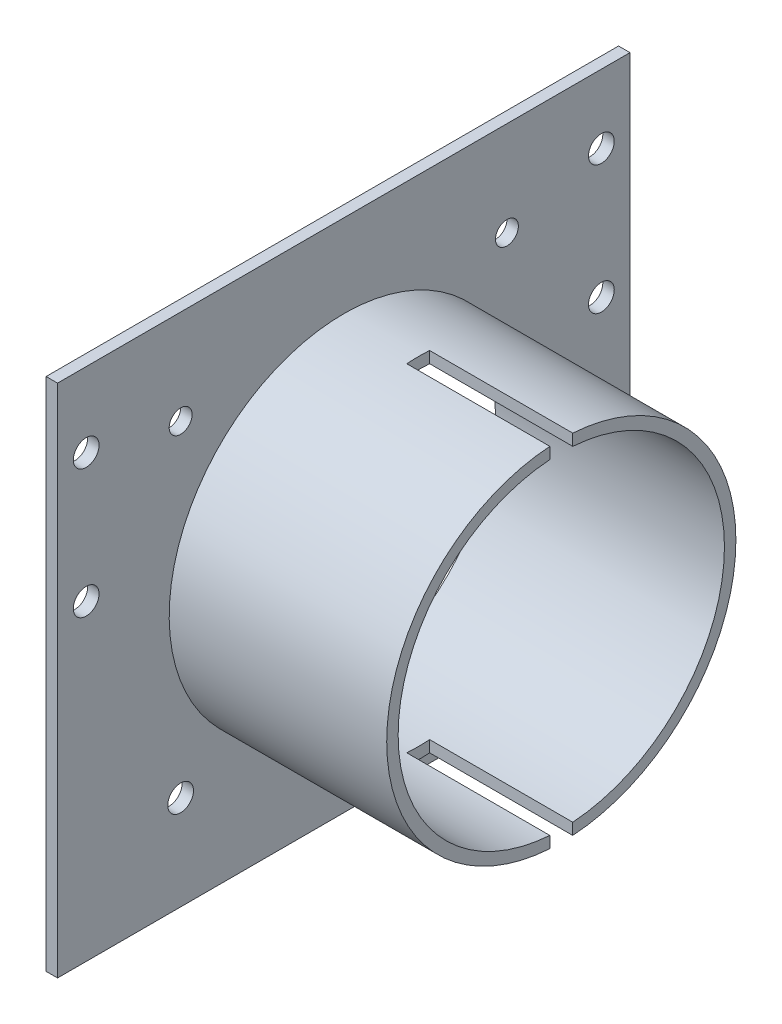
ISO-10303-21;
HEADER;
FILE_DESCRIPTION(('STEP AP214'),'2;1');
FILE_NAME('part.step','',(''),(''),'','','');
FILE_SCHEMA(('AUTOMOTIVE_DESIGN { 1 0 10303 214 1 1 1 1 }'));
ENDSEC;
DATA;
#1=APPLICATION_CONTEXT('core data for automotive mechanical design processes');
#2=APPLICATION_PROTOCOL_DEFINITION('international standard','automotive_design',2000,#1);
#3=PRODUCT_CONTEXT('',#1,'mechanical');
#4=PRODUCT('Part','Part','',(#3));
#5=PRODUCT_RELATED_PRODUCT_CATEGORY('part','',(#4));
#6=PRODUCT_DEFINITION_FORMATION('','',#4);
#7=PRODUCT_DEFINITION_CONTEXT('part definition',#1,'design');
#8=PRODUCT_DEFINITION('design','',#6,#7);
#9=PRODUCT_DEFINITION_SHAPE('','',#8);
#10=(LENGTH_UNIT() NAMED_UNIT(*) SI_UNIT(.MILLI.,.METRE.));
#11=(NAMED_UNIT(*) PLANE_ANGLE_UNIT() SI_UNIT($,.RADIAN.));
#12=(NAMED_UNIT(*) SI_UNIT($,.STERADIAN.) SOLID_ANGLE_UNIT());
#13=UNCERTAINTY_MEASURE_WITH_UNIT(LENGTH_MEASURE(1.E-05),#10,'distance_accuracy_value','');
#14=(GEOMETRIC_REPRESENTATION_CONTEXT(3) GLOBAL_UNCERTAINTY_ASSIGNED_CONTEXT((#13)) GLOBAL_UNIT_ASSIGNED_CONTEXT((#10,
#11,#12)) REPRESENTATION_CONTEXT('',''));
#15=CARTESIAN_POINT('',(0.,0.,0.));
#16=DIRECTION('',(0.,0.,1.));
#17=DIRECTION('',(1.,0.,0.));
#18=AXIS2_PLACEMENT_3D('',#15,#16,#17);
#19=CARTESIAN_POINT('',(80.,0.,0.));
#20=DIRECTION('',(1.,0.,0.));
#21=DIRECTION('',(0.,0.,-1.));
#22=AXIS2_PLACEMENT_3D('',#19,#20,#21);
#23=PLANE('',#22);
#24=DIRECTION('',(0.,-1.,0.));
#25=VECTOR('',#24,1.);
#26=CARTESIAN_POINT('',(80.,45.4181911125714,4.));
#27=LINE('',#26,#25);
#28=CARTESIAN_POINT('',(80.,60.8687111741328,4.));
#29=VERTEX_POINT('',#28);
#30=CARTESIAN_POINT('',(80.,56.859475903318,4.));
#31=VERTEX_POINT('',#30);
#32=EDGE_CURVE('E255',#29,#31,#27,.T.);
#33=ORIENTED_EDGE('',*,*,#32,.F.);
#34=CARTESIAN_POINT('',(80.,0.,0.));
#35=DIRECTION('',(1.,0.,0.));
#36=DIRECTION('',(0.,0.,-1.));
#37=AXIS2_PLACEMENT_3D('',#34,#35,#36);
#38=CIRCLE('',#37,61.);
#39=CARTESIAN_POINT('',(80.,-60.8687111741328,4.));
#40=VERTEX_POINT('',#39);
#41=EDGE_CURVE('E153',#29,#40,#38,.T.);
#42=ORIENTED_EDGE('',*,*,#41,.T.);
#43=DIRECTION('',(0.,-1.,0.));
#44=VECTOR('',#43,1.);
#45=CARTESIAN_POINT('',(80.,-45.4181911125714,4.));
#46=LINE('',#45,#44);
#47=CARTESIAN_POINT('',(80.,-56.859475903318,4.));
#48=VERTEX_POINT('',#47);
#49=EDGE_CURVE('E145',#48,#40,#46,.T.);
#50=ORIENTED_EDGE('',*,*,#49,.F.);
#51=CARTESIAN_POINT('',(80.,0.,0.));
#52=DIRECTION('',(1.,0.,0.));
#53=DIRECTION('',(0.,0.,-1.));
#54=AXIS2_PLACEMENT_3D('',#51,#52,#53);
#55=CIRCLE('',#54,57.);
#56=EDGE_CURVE('E159',#31,#48,#55,.T.);
#57=ORIENTED_EDGE('',*,*,#56,.F.);
#58=EDGE_LOOP('',(#33,#42,#50,#57));
#59=FACE_BOUND('',#58,.T.);
#60=ADVANCED_FACE('F33',(#59),#23,.T.);
#61=CARTESIAN_POINT('',(4.,0.,0.));
#62=DIRECTION('',(1.,0.,0.));
#63=DIRECTION('',(0.,0.,-1.));
#64=AXIS2_PLACEMENT_3D('',#61,#62,#63);
#65=PLANE('',#64);
#66=CARTESIAN_POINT('',(4.,64.,89.9999999999999));
#67=DIRECTION('',(1.,0.,0.));
#68=DIRECTION('',(0.,0.,-1.));
#69=AXIS2_PLACEMENT_3D('',#66,#67,#68);
#70=CIRCLE('',#69,4.49999999999999);
#71=CARTESIAN_POINT('',(4.,64.,85.4999999999999));
#72=VERTEX_POINT('',#71);
#73=EDGE_CURVE('E230',#72,#72,#70,.T.);
#74=ORIENTED_EDGE('',*,*,#73,.F.);
#75=EDGE_LOOP('',(#74));
#76=FACE_BOUND('',#75,.T.);
#77=CARTESIAN_POINT('',(4.,19.,89.9999999999999));
#78=DIRECTION('',(1.,0.,0.));
#79=DIRECTION('',(0.,0.,-1.));
#80=AXIS2_PLACEMENT_3D('',#77,#78,#79);
#81=CIRCLE('',#80,4.49999999999999);
#82=CARTESIAN_POINT('',(4.,19.,85.4999999999999));
#83=VERTEX_POINT('',#82);
#84=EDGE_CURVE('E220',#83,#83,#81,.T.);
#85=ORIENTED_EDGE('',*,*,#84,.F.);
#86=EDGE_LOOP('',(#85));
#87=FACE_BOUND('',#86,.T.);
#88=CARTESIAN_POINT('',(4.,65.9973921924765,-90.0000000000001));
#89=DIRECTION('',(1.,0.,0.));
#90=DIRECTION('',(0.,0.,-1.));
#91=AXIS2_PLACEMENT_3D('',#88,#89,#90);
#92=CIRCLE('',#91,4.49999999999999);
#93=CARTESIAN_POINT('',(4.,65.9973921924765,-94.5000000000001));
#94=VERTEX_POINT('',#93);
#95=EDGE_CURVE('E217',#94,#94,#92,.T.);
#96=ORIENTED_EDGE('',*,*,#95,.F.);
#97=EDGE_LOOP('',(#96));
#98=FACE_BOUND('',#97,.T.);
#99=CARTESIAN_POINT('',(4.,20.9973921924765,-90.0000000000001));
#100=DIRECTION('',(1.,0.,0.));
#101=DIRECTION('',(0.,0.,-1.));
#102=AXIS2_PLACEMENT_3D('',#99,#100,#101);
#103=CIRCLE('',#102,4.49999999999999);
#104=CARTESIAN_POINT('',(4.,20.9973921924765,-94.5000000000001));
#105=VERTEX_POINT('',#104);
#106=EDGE_CURVE('E216',#105,#105,#103,.T.);
#107=ORIENTED_EDGE('',*,*,#106,.F.);
#108=EDGE_LOOP('',(#107));
#109=FACE_BOUND('',#108,.T.);
#110=CARTESIAN_POINT('',(4.,-57.,-57.));
#111=DIRECTION('',(1.,0.,0.));
#112=DIRECTION('',(0.,0.,-1.));
#113=AXIS2_PLACEMENT_3D('',#110,#111,#112);
#114=CIRCLE('',#113,4.49999999999999);
#115=CARTESIAN_POINT('',(4.,-57.,-61.5));
#116=VERTEX_POINT('',#115);
#117=EDGE_CURVE('E238',#116,#116,#114,.T.);
#118=ORIENTED_EDGE('',*,*,#117,.F.);
#119=EDGE_LOOP('',(#118));
#120=FACE_BOUND('',#119,.T.);
#121=CARTESIAN_POINT('',(4.,-57.,56.9999999999999));
#122=DIRECTION('',(1.,0.,0.));
#123=DIRECTION('',(0.,0.,-1.));
#124=AXIS2_PLACEMENT_3D('',#121,#122,#123);
#125=CIRCLE('',#124,4.49999999999999);
#126=CARTESIAN_POINT('',(4.,-57.,52.5));
#127=VERTEX_POINT('',#126);
#128=EDGE_CURVE('E244',#127,#127,#125,.T.);
#129=ORIENTED_EDGE('',*,*,#128,.F.);
#130=EDGE_LOOP('',(#129));
#131=FACE_BOUND('',#130,.T.);
#132=CARTESIAN_POINT('',(4.,57.,-57.));
#133=DIRECTION('',(1.,0.,0.));
#134=DIRECTION('',(0.,0.,1.));
#135=AXIS2_PLACEMENT_3D('',#132,#133,#134);
#136=CIRCLE('',#135,4.00000000000004);
#137=CARTESIAN_POINT('',(4.,57.,-53.));
#138=VERTEX_POINT('',#137);
#139=EDGE_CURVE('E164',#138,#138,#136,.T.);
#140=ORIENTED_EDGE('',*,*,#139,.F.);
#141=EDGE_LOOP('',(#140));
#142=FACE_BOUND('',#141,.T.);
#143=DIRECTION('',(0.,1.,0.));
#144=VECTOR('',#143,1.);
#145=CARTESIAN_POINT('',(4.,90.,-100.));
#146=LINE('',#145,#144);
#147=CARTESIAN_POINT('',(4.,-90.,-100.));
#148=VERTEX_POINT('',#147);
#149=CARTESIAN_POINT('',(4.,90.,-100.));
#150=VERTEX_POINT('',#149);
#151=EDGE_CURVE('E179',#148,#150,#146,.T.);
#152=ORIENTED_EDGE('',*,*,#151,.T.);
#153=DIRECTION('',(0.,0.,1.));
#154=VECTOR('',#153,1.);
#155=CARTESIAN_POINT('',(4.,90.,100.));
#156=LINE('',#155,#154);
#157=CARTESIAN_POINT('',(4.,90.,100.));
#158=VERTEX_POINT('',#157);
#159=EDGE_CURVE('E182',#150,#158,#156,.T.);
#160=ORIENTED_EDGE('',*,*,#159,.T.);
#161=DIRECTION('',(0.,-1.,0.));
#162=VECTOR('',#161,1.);
#163=CARTESIAN_POINT('',(4.,90.,100.));
#164=LINE('',#163,#162);
#165=CARTESIAN_POINT('',(4.,-90.,100.));
#166=VERTEX_POINT('',#165);
#167=EDGE_CURVE('E185',#158,#166,#164,.T.);
#168=ORIENTED_EDGE('',*,*,#167,.T.);
#169=DIRECTION('',(0.,0.,-1.));
#170=VECTOR('',#169,1.);
#171=CARTESIAN_POINT('',(4.,-90.,100.));
#172=LINE('',#171,#170);
#173=EDGE_CURVE('E187',#166,#148,#172,.T.);
#174=ORIENTED_EDGE('',*,*,#173,.T.);
#175=EDGE_LOOP('',(#152,#160,#168,#174));
#176=FACE_BOUND('',#175,.T.);
#177=CARTESIAN_POINT('',(4.,57.,57.));
#178=DIRECTION('',(1.,0.,0.));
#179=DIRECTION('',(0.,0.,-1.));
#180=AXIS2_PLACEMENT_3D('',#177,#178,#179);
#181=CIRCLE('',#180,4.);
#182=CARTESIAN_POINT('',(4.,57.,53.));
#183=VERTEX_POINT('',#182);
#184=EDGE_CURVE('E170',#183,#183,#181,.T.);
#185=ORIENTED_EDGE('',*,*,#184,.F.);
#186=EDGE_LOOP('',(#185));
#187=FACE_BOUND('',#186,.T.);
#188=CARTESIAN_POINT('',(4.,0.,0.));
#189=DIRECTION('',(1.,0.,0.));
#190=DIRECTION('',(0.,0.,-1.));
#191=AXIS2_PLACEMENT_3D('',#188,#189,#190);
#192=CIRCLE('',#191,61.);
#193=CARTESIAN_POINT('',(4.,0.,-61.));
#194=VERTEX_POINT('',#193);
#195=EDGE_CURVE('E154',#194,#194,#192,.T.);
#196=ORIENTED_EDGE('',*,*,#195,.F.);
#197=EDGE_LOOP('',(#196));
#198=FACE_BOUND('',#197,.T.);
#199=ADVANCED_FACE('F299',(#76,#87,#98,#109,#120,#131,#142,#176,#187,#198),#65,.T.);
#200=CARTESIAN_POINT('',(0.,0.,0.));
#201=DIRECTION('',(1.,0.,0.));
#202=DIRECTION('',(0.,0.,-1.));
#203=AXIS2_PLACEMENT_3D('',#200,#201,#202);
#204=PLANE('',#203);
#205=CARTESIAN_POINT('',(0.,64.,89.9999999999999));
#206=DIRECTION('',(1.,0.,0.));
#207=DIRECTION('',(0.,0.,-1.));
#208=AXIS2_PLACEMENT_3D('',#205,#206,#207);
#209=CIRCLE('',#208,4.5);
#210=CARTESIAN_POINT('',(0.,64.,85.4999999999999));
#211=VERTEX_POINT('',#210);
#212=EDGE_CURVE('E37',#211,#211,#209,.T.);
#213=ORIENTED_EDGE('',*,*,#212,.T.);
#214=EDGE_LOOP('',(#213));
#215=FACE_BOUND('',#214,.T.);
#216=CARTESIAN_POINT('',(0.,19.,89.9999999999999));
#217=DIRECTION('',(1.,0.,0.));
#218=DIRECTION('',(0.,0.,-1.));
#219=AXIS2_PLACEMENT_3D('',#216,#217,#218);
#220=CIRCLE('',#219,4.49999999999999);
#221=CARTESIAN_POINT('',(0.,19.,85.4999999999999));
#222=VERTEX_POINT('',#221);
#223=EDGE_CURVE('E218',#222,#222,#220,.T.);
#224=ORIENTED_EDGE('',*,*,#223,.T.);
#225=EDGE_LOOP('',(#224));
#226=FACE_BOUND('',#225,.T.);
#227=CARTESIAN_POINT('',(0.,65.9973921924765,-90.0000000000001));
#228=DIRECTION('',(1.,0.,0.));
#229=DIRECTION('',(0.,0.,-1.));
#230=AXIS2_PLACEMENT_3D('',#227,#228,#229);
#231=CIRCLE('',#230,4.5);
#232=CARTESIAN_POINT('',(0.,65.9973921924765,-94.5000000000001));
#233=VERTEX_POINT('',#232);
#234=EDGE_CURVE('E214',#233,#233,#231,.T.);
#235=ORIENTED_EDGE('',*,*,#234,.T.);
#236=EDGE_LOOP('',(#235));
#237=FACE_BOUND('',#236,.T.);
#238=CARTESIAN_POINT('',(0.,20.9973921924765,-90.0000000000001));
#239=DIRECTION('',(1.,0.,0.));
#240=DIRECTION('',(0.,0.,-1.));
#241=AXIS2_PLACEMENT_3D('',#238,#239,#240);
#242=CIRCLE('',#241,4.49999999999999);
#243=CARTESIAN_POINT('',(0.,20.9973921924765,-94.5000000000001));
#244=VERTEX_POINT('',#243);
#245=EDGE_CURVE('E235',#244,#244,#242,.T.);
#246=ORIENTED_EDGE('',*,*,#245,.T.);
#247=EDGE_LOOP('',(#246));
#248=FACE_BOUND('',#247,.T.);
#249=CARTESIAN_POINT('',(0.,-57.,-57.));
#250=DIRECTION('',(1.,0.,0.));
#251=DIRECTION('',(0.,0.,-1.));
#252=AXIS2_PLACEMENT_3D('',#249,#250,#251);
#253=CIRCLE('',#252,4.49999999999999);
#254=CARTESIAN_POINT('',(0.,-57.,-61.5));
#255=VERTEX_POINT('',#254);
#256=EDGE_CURVE('E241',#255,#255,#253,.T.);
#257=ORIENTED_EDGE('',*,*,#256,.T.);
#258=EDGE_LOOP('',(#257));
#259=FACE_BOUND('',#258,.T.);
#260=CARTESIAN_POINT('',(0.,-57.,56.9999999999999));
#261=DIRECTION('',(1.,0.,0.));
#262=DIRECTION('',(0.,0.,-1.));
#263=AXIS2_PLACEMENT_3D('',#260,#261,#262);
#264=CIRCLE('',#263,4.49999999999999);
#265=CARTESIAN_POINT('',(0.,-57.,52.5));
#266=VERTEX_POINT('',#265);
#267=EDGE_CURVE('E146',#266,#266,#264,.T.);
#268=ORIENTED_EDGE('',*,*,#267,.T.);
#269=EDGE_LOOP('',(#268));
#270=FACE_BOUND('',#269,.T.);
#271=DIRECTION('',(0.,1.,0.));
#272=VECTOR('',#271,1.);
#273=CARTESIAN_POINT('',(0.,90.,-100.));
#274=LINE('',#273,#272);
#275=CARTESIAN_POINT('',(0.,-90.,-100.));
#276=VERTEX_POINT('',#275);
#277=CARTESIAN_POINT('',(0.,90.,-100.));
#278=VERTEX_POINT('',#277);
#279=EDGE_CURVE('E178',#276,#278,#274,.T.);
#280=ORIENTED_EDGE('',*,*,#279,.F.);
#281=DIRECTION('',(0.,0.,-1.));
#282=VECTOR('',#281,1.);
#283=CARTESIAN_POINT('',(0.,-90.,100.));
#284=LINE('',#283,#282);
#285=CARTESIAN_POINT('',(0.,-90.,100.));
#286=VERTEX_POINT('',#285);
#287=EDGE_CURVE('E183',#286,#276,#284,.T.);
#288=ORIENTED_EDGE('',*,*,#287,.F.);
#289=DIRECTION('',(0.,-1.,0.));
#290=VECTOR('',#289,1.);
#291=CARTESIAN_POINT('',(0.,90.,100.));
#292=LINE('',#291,#290);
#293=CARTESIAN_POINT('',(0.,90.,100.));
#294=VERTEX_POINT('',#293);
#295=EDGE_CURVE('E194',#294,#286,#292,.T.);
#296=ORIENTED_EDGE('',*,*,#295,.F.);
#297=DIRECTION('',(0.,0.,1.));
#298=VECTOR('',#297,1.);
#299=CARTESIAN_POINT('',(0.,90.,100.));
#300=LINE('',#299,#298);
#301=EDGE_CURVE('E192',#278,#294,#300,.T.);
#302=ORIENTED_EDGE('',*,*,#301,.F.);
#303=EDGE_LOOP('',(#280,#288,#296,#302));
#304=FACE_BOUND('',#303,.T.);
#305=CARTESIAN_POINT('',(0.,0.,0.));
#306=DIRECTION('',(1.,0.,0.));
#307=DIRECTION('',(0.,0.,-1.));
#308=AXIS2_PLACEMENT_3D('',#305,#306,#307);
#309=CIRCLE('',#308,57.);
#310=CARTESIAN_POINT('',(0.,0.,-57.));
#311=VERTEX_POINT('',#310);
#312=EDGE_CURVE('E173',#311,#311,#309,.T.);
#313=ORIENTED_EDGE('',*,*,#312,.T.);
#314=EDGE_LOOP('',(#313));
#315=FACE_BOUND('',#314,.T.);
#316=CARTESIAN_POINT('',(0.,57.,57.));
#317=DIRECTION('',(1.,0.,0.));
#318=DIRECTION('',(0.,0.,-1.));
#319=AXIS2_PLACEMENT_3D('',#316,#317,#318);
#320=CIRCLE('',#319,4.);
#321=CARTESIAN_POINT('',(0.,57.,53.));
#322=VERTEX_POINT('',#321);
#323=EDGE_CURVE('E167',#322,#322,#320,.T.);
#324=ORIENTED_EDGE('',*,*,#323,.T.);
#325=EDGE_LOOP('',(#324));
#326=FACE_BOUND('',#325,.T.);
#327=CARTESIAN_POINT('',(0.,57.,-57.));
#328=DIRECTION('',(1.,0.,0.));
#329=DIRECTION('',(0.,0.,1.));
#330=AXIS2_PLACEMENT_3D('',#327,#328,#329);
#331=CIRCLE('',#330,4.00000000000004);
#332=CARTESIAN_POINT('',(0.,57.,-53.));
#333=VERTEX_POINT('',#332);
#334=EDGE_CURVE('E157',#333,#333,#331,.T.);
#335=ORIENTED_EDGE('',*,*,#334,.T.);
#336=EDGE_LOOP('',(#335));
#337=FACE_BOUND('',#336,.T.);
#338=ADVANCED_FACE('F305',(#215,#226,#237,#248,#259,#270,#304,#315,#326,#337),#204,.F.);
#339=CARTESIAN_POINT('',(4.,90.,-100.));
#340=DIRECTION('',(0.,0.,1.));
#341=DIRECTION('',(1.,0.,0.));
#342=AXIS2_PLACEMENT_3D('',#339,#340,#341);
#343=PLANE('',#342);
#344=ORIENTED_EDGE('',*,*,#279,.T.);
#345=DIRECTION('',(-1.,0.,0.));
#346=VECTOR('',#345,1.);
#347=CARTESIAN_POINT('',(4.,90.,-100.));
#348=LINE('',#347,#346);
#349=EDGE_CURVE('E205',#150,#278,#348,.T.);
#350=ORIENTED_EDGE('',*,*,#349,.F.);
#351=ORIENTED_EDGE('',*,*,#151,.F.);
#352=DIRECTION('',(-1.,0.,0.));
#353=VECTOR('',#352,1.);
#354=CARTESIAN_POINT('',(4.,-90.,-100.));
#355=LINE('',#354,#353);
#356=EDGE_CURVE('E189',#148,#276,#355,.T.);
#357=ORIENTED_EDGE('',*,*,#356,.T.);
#358=EDGE_LOOP('',(#344,#350,#351,#357));
#359=FACE_BOUND('',#358,.T.);
#360=ADVANCED_FACE('F35',(#359),#343,.F.);
#361=CARTESIAN_POINT('',(4.,90.,100.));
#362=DIRECTION('',(0.,-1.,0.));
#363=DIRECTION('',(0.,0.,-1.));
#364=AXIS2_PLACEMENT_3D('',#361,#362,#363);
#365=PLANE('',#364);
#366=ORIENTED_EDGE('',*,*,#301,.T.);
#367=DIRECTION('',(-1.,0.,0.));
#368=VECTOR('',#367,1.);
#369=CARTESIAN_POINT('',(4.,90.,100.));
#370=LINE('',#369,#368);
#371=EDGE_CURVE('E202',#158,#294,#370,.T.);
#372=ORIENTED_EDGE('',*,*,#371,.F.);
#373=ORIENTED_EDGE('',*,*,#159,.F.);
#374=ORIENTED_EDGE('',*,*,#349,.T.);
#375=EDGE_LOOP('',(#366,#372,#373,#374));
#376=FACE_BOUND('',#375,.T.);
#377=ADVANCED_FACE('F337',(#376),#365,.F.);
#378=CARTESIAN_POINT('',(4.,90.,100.));
#379=DIRECTION('',(0.,0.,-1.));
#380=DIRECTION('',(-1.,0.,0.));
#381=AXIS2_PLACEMENT_3D('',#378,#379,#380);
#382=PLANE('',#381);
#383=ORIENTED_EDGE('',*,*,#295,.T.);
#384=DIRECTION('',(-1.,0.,0.));
#385=VECTOR('',#384,1.);
#386=CARTESIAN_POINT('',(4.,-90.,100.));
#387=LINE('',#386,#385);
#388=EDGE_CURVE('E199',#166,#286,#387,.T.);
#389=ORIENTED_EDGE('',*,*,#388,.F.);
#390=ORIENTED_EDGE('',*,*,#167,.F.);
#391=ORIENTED_EDGE('',*,*,#371,.T.);
#392=EDGE_LOOP('',(#383,#389,#390,#391));
#393=FACE_BOUND('',#392,.T.);
#394=ADVANCED_FACE('F334',(#393),#382,.F.);
#395=CARTESIAN_POINT('',(4.,-90.,100.));
#396=DIRECTION('',(0.,1.,0.));
#397=DIRECTION('',(0.,0.,1.));
#398=AXIS2_PLACEMENT_3D('',#395,#396,#397);
#399=PLANE('',#398);
#400=ORIENTED_EDGE('',*,*,#287,.T.);
#401=ORIENTED_EDGE('',*,*,#356,.F.);
#402=ORIENTED_EDGE('',*,*,#173,.F.);
#403=ORIENTED_EDGE('',*,*,#388,.T.);
#404=EDGE_LOOP('',(#400,#401,#402,#403));
#405=FACE_BOUND('',#404,.T.);
#406=ADVANCED_FACE('F327',(#405),#399,.F.);
#407=CARTESIAN_POINT('',(4.,0.,0.));
#408=DIRECTION('',(-1.,0.,0.));
#409=DIRECTION('',(0.,0.,1.));
#410=AXIS2_PLACEMENT_3D('',#407,#408,#409);
#411=CYLINDRICAL_SURFACE('',#410,57.);
#412=DIRECTION('',(-1.,0.,0.));
#413=VECTOR('',#412,1.);
#414=CARTESIAN_POINT('',(4.,56.859475903318,4.));
#415=LINE('',#414,#413);
#416=CARTESIAN_POINT('',(30.,56.859475903318,4.));
#417=VERTEX_POINT('',#416);
#418=EDGE_CURVE('E270',#31,#417,#415,.T.);
#419=ORIENTED_EDGE('',*,*,#418,.F.);
#420=ORIENTED_EDGE('',*,*,#56,.T.);
#421=DIRECTION('',(-1.,0.,0.));
#422=VECTOR('',#421,1.);
#423=CARTESIAN_POINT('',(4.,-56.859475903318,4.));
#424=LINE('',#423,#422);
#425=CARTESIAN_POINT('',(30.,-56.859475903318,4.));
#426=VERTEX_POINT('',#425);
#427=EDGE_CURVE('E262',#426,#48,#424,.F.);
#428=ORIENTED_EDGE('',*,*,#427,.F.);
#429=CARTESIAN_POINT('',(30.,0.,0.));
#430=DIRECTION('',(-1.,0.,0.));
#431=DIRECTION('',(0.,0.,1.));
#432=AXIS2_PLACEMENT_3D('',#429,#430,#431);
#433=CIRCLE('',#432,57.);
#434=CARTESIAN_POINT('',(30.,-56.859475903318,-4.));
#435=VERTEX_POINT('',#434);
#436=EDGE_CURVE('E254',#435,#426,#433,.T.);
#437=ORIENTED_EDGE('',*,*,#436,.F.);
#438=DIRECTION('',(-1.,0.,0.));
#439=VECTOR('',#438,1.);
#440=CARTESIAN_POINT('',(4.,-56.859475903318,-4.));
#441=LINE('',#440,#439);
#442=CARTESIAN_POINT('',(80.,-56.859475903318,-4.));
#443=VERTEX_POINT('',#442);
#444=EDGE_CURVE('E264',#443,#435,#441,.T.);
#445=ORIENTED_EDGE('',*,*,#444,.F.);
#446=CARTESIAN_POINT('',(80.,56.859475903318,-4.));
#447=VERTEX_POINT('',#446);
#448=EDGE_CURVE('E144',#443,#447,#55,.T.);
#449=ORIENTED_EDGE('',*,*,#448,.T.);
#450=DIRECTION('',(-1.,0.,0.));
#451=VECTOR('',#450,1.);
#452=CARTESIAN_POINT('',(4.,56.859475903318,-4.));
#453=LINE('',#452,#451);
#454=CARTESIAN_POINT('',(30.,56.859475903318,-4.));
#455=VERTEX_POINT('',#454);
#456=EDGE_CURVE('E269',#455,#447,#453,.F.);
#457=ORIENTED_EDGE('',*,*,#456,.F.);
#458=CARTESIAN_POINT('',(30.,0.,0.));
#459=DIRECTION('',(1.,0.,0.));
#460=DIRECTION('',(0.,0.,-1.));
#461=AXIS2_PLACEMENT_3D('',#458,#459,#460);
#462=CIRCLE('',#461,57.);
#463=EDGE_CURVE('E266',#455,#417,#462,.T.);
#464=ORIENTED_EDGE('',*,*,#463,.T.);
#465=EDGE_LOOP('',(#419,#420,#428,#437,#445,#449,#457,#464));
#466=FACE_BOUND('',#465,.T.);
#467=ORIENTED_EDGE('',*,*,#312,.F.);
#468=EDGE_LOOP('',(#467));
#469=FACE_BOUND('',#468,.T.);
#470=ADVANCED_FACE('F279',(#466,#469),#411,.F.);
#471=CARTESIAN_POINT('',(4.,57.,57.));
#472=DIRECTION('',(-1.,0.,0.));
#473=DIRECTION('',(0.,0.,1.));
#474=AXIS2_PLACEMENT_3D('',#471,#472,#473);
#475=CYLINDRICAL_SURFACE('',#474,4.);
#476=ORIENTED_EDGE('',*,*,#184,.T.);
#477=EDGE_LOOP('',(#476));
#478=FACE_BOUND('',#477,.T.);
#479=ORIENTED_EDGE('',*,*,#323,.F.);
#480=EDGE_LOOP('',(#479));
#481=FACE_BOUND('',#480,.T.);
#482=ADVANCED_FACE('F316',(#478,#481),#475,.F.);
#483=CARTESIAN_POINT('',(4.,57.,-57.));
#484=DIRECTION('',(-1.,0.,0.));
#485=DIRECTION('',(0.,0.,1.));
#486=AXIS2_PLACEMENT_3D('',#483,#484,#485);
#487=CYLINDRICAL_SURFACE('',#486,4.00000000000004);
#488=ORIENTED_EDGE('',*,*,#139,.T.);
#489=EDGE_LOOP('',(#488));
#490=FACE_BOUND('',#489,.T.);
#491=ORIENTED_EDGE('',*,*,#334,.F.);
#492=EDGE_LOOP('',(#491));
#493=FACE_BOUND('',#492,.T.);
#494=ADVANCED_FACE('F311',(#490,#493),#487,.F.);
#495=DIRECTION('',(0.,1.,0.));
#496=VECTOR('',#495,1.);
#497=CARTESIAN_POINT('',(80.,45.4181911125714,-4.));
#498=LINE('',#497,#496);
#499=CARTESIAN_POINT('',(80.,60.8687111741328,-4.));
#500=VERTEX_POINT('',#499);
#501=EDGE_CURVE('E252',#447,#500,#498,.T.);
#502=ORIENTED_EDGE('',*,*,#501,.F.);
#503=ORIENTED_EDGE('',*,*,#448,.F.);
#504=DIRECTION('',(0.,1.,0.));
#505=VECTOR('',#504,1.);
#506=CARTESIAN_POINT('',(80.,-45.4181911125714,-4.));
#507=LINE('',#506,#505);
#508=CARTESIAN_POINT('',(80.,-60.8687111741328,-4.));
#509=VERTEX_POINT('',#508);
#510=EDGE_CURVE('E127',#509,#443,#507,.T.);
#511=ORIENTED_EDGE('',*,*,#510,.F.);
#512=EDGE_CURVE('E142',#509,#500,#38,.T.);
#513=ORIENTED_EDGE('',*,*,#512,.T.);
#514=EDGE_LOOP('',(#502,#503,#511,#513));
#515=FACE_BOUND('',#514,.T.);
#516=ADVANCED_FACE('F141',(#515),#23,.T.);
#517=CARTESIAN_POINT('',(80.,0.,0.));
#518=DIRECTION('',(-1.,0.,0.));
#519=DIRECTION('',(0.,0.,1.));
#520=AXIS2_PLACEMENT_3D('',#517,#518,#519);
#521=CYLINDRICAL_SURFACE('',#520,61.);
#522=ORIENTED_EDGE('',*,*,#41,.F.);
#523=DIRECTION('',(-1.,0.,0.));
#524=VECTOR('',#523,1.);
#525=CARTESIAN_POINT('',(80.,60.8687111741328,4.));
#526=LINE('',#525,#524);
#527=CARTESIAN_POINT('',(30.,60.8687111741328,4.));
#528=VERTEX_POINT('',#527);
#529=EDGE_CURVE('E11',#29,#528,#526,.T.);
#530=ORIENTED_EDGE('',*,*,#529,.T.);
#531=CARTESIAN_POINT('',(30.,0.,0.));
#532=DIRECTION('',(1.,0.,0.));
#533=DIRECTION('',(0.,0.,-1.));
#534=AXIS2_PLACEMENT_3D('',#531,#532,#533);
#535=CIRCLE('',#534,61.);
#536=CARTESIAN_POINT('',(30.,60.8687111741328,-4.));
#537=VERTEX_POINT('',#536);
#538=EDGE_CURVE('E134',#537,#528,#535,.T.);
#539=ORIENTED_EDGE('',*,*,#538,.F.);
#540=DIRECTION('',(-1.,0.,0.));
#541=VECTOR('',#540,1.);
#542=CARTESIAN_POINT('',(80.,60.8687111741328,-4.));
#543=LINE('',#542,#541);
#544=EDGE_CURVE('E42',#537,#500,#543,.F.);
#545=ORIENTED_EDGE('',*,*,#544,.T.);
#546=ORIENTED_EDGE('',*,*,#512,.F.);
#547=DIRECTION('',(-1.,0.,0.));
#548=VECTOR('',#547,1.);
#549=CARTESIAN_POINT('',(80.,-60.8687111741328,-4.));
#550=LINE('',#549,#548);
#551=CARTESIAN_POINT('',(30.,-60.8687111741328,-4.));
#552=VERTEX_POINT('',#551);
#553=EDGE_CURVE('E124',#509,#552,#550,.T.);
#554=ORIENTED_EDGE('',*,*,#553,.T.);
#555=CARTESIAN_POINT('',(30.,0.,0.));
#556=DIRECTION('',(-1.,0.,0.));
#557=DIRECTION('',(0.,0.,1.));
#558=AXIS2_PLACEMENT_3D('',#555,#556,#557);
#559=CIRCLE('',#558,61.);
#560=CARTESIAN_POINT('',(30.,-60.8687111741328,4.));
#561=VERTEX_POINT('',#560);
#562=EDGE_CURVE('E208',#552,#561,#559,.T.);
#563=ORIENTED_EDGE('',*,*,#562,.T.);
#564=DIRECTION('',(-1.,0.,0.));
#565=VECTOR('',#564,1.);
#566=CARTESIAN_POINT('',(80.,-60.8687111741328,4.));
#567=LINE('',#566,#565);
#568=EDGE_CURVE('E135',#561,#40,#567,.F.);
#569=ORIENTED_EDGE('',*,*,#568,.T.);
#570=EDGE_LOOP('',(#522,#530,#539,#545,#546,#554,#563,#569));
#571=FACE_BOUND('',#570,.T.);
#572=ORIENTED_EDGE('',*,*,#195,.T.);
#573=EDGE_LOOP('',(#572));
#574=FACE_BOUND('',#573,.T.);
#575=ADVANCED_FACE('F150',(#571,#574),#521,.T.);
#576=CARTESIAN_POINT('',(30.,-45.4181911125714,-4.));
#577=DIRECTION('',(0.,0.,-1.));
#578=DIRECTION('',(-1.,0.,0.));
#579=AXIS2_PLACEMENT_3D('',#576,#577,#578);
#580=PLANE('',#579);
#581=ORIENTED_EDGE('',*,*,#444,.T.);
#582=DIRECTION('',(0.,1.,0.));
#583=VECTOR('',#582,1.);
#584=CARTESIAN_POINT('',(30.,-45.4181911125714,-4.));
#585=LINE('',#584,#583);
#586=EDGE_CURVE('E130',#552,#435,#585,.T.);
#587=ORIENTED_EDGE('',*,*,#586,.F.);
#588=ORIENTED_EDGE('',*,*,#553,.F.);
#589=ORIENTED_EDGE('',*,*,#510,.T.);
#590=EDGE_LOOP('',(#581,#587,#588,#589));
#591=FACE_BOUND('',#590,.T.);
#592=ADVANCED_FACE('F126',(#591),#580,.F.);
#593=CARTESIAN_POINT('',(30.,-45.4181911125714,4.));
#594=DIRECTION('',(0.,0.,1.));
#595=DIRECTION('',(1.,0.,0.));
#596=AXIS2_PLACEMENT_3D('',#593,#594,#595);
#597=PLANE('',#596);
#598=ORIENTED_EDGE('',*,*,#427,.T.);
#599=ORIENTED_EDGE('',*,*,#49,.T.);
#600=ORIENTED_EDGE('',*,*,#568,.F.);
#601=DIRECTION('',(0.,-1.,0.));
#602=VECTOR('',#601,1.);
#603=CARTESIAN_POINT('',(30.,-45.4181911125714,4.));
#604=LINE('',#603,#602);
#605=EDGE_CURVE('E58',#426,#561,#604,.T.);
#606=ORIENTED_EDGE('',*,*,#605,.F.);
#607=EDGE_LOOP('',(#598,#599,#600,#606));
#608=FACE_BOUND('',#607,.T.);
#609=ADVANCED_FACE('F286',(#608),#597,.F.);
#610=CARTESIAN_POINT('',(30.,0.,0.));
#611=DIRECTION('',(-1.,0.,0.));
#612=DIRECTION('',(0.,0.,1.));
#613=AXIS2_PLACEMENT_3D('',#610,#611,#612);
#614=PLANE('',#613);
#615=ORIENTED_EDGE('',*,*,#436,.T.);
#616=ORIENTED_EDGE('',*,*,#605,.T.);
#617=ORIENTED_EDGE('',*,*,#562,.F.);
#618=ORIENTED_EDGE('',*,*,#586,.T.);
#619=EDGE_LOOP('',(#615,#616,#617,#618));
#620=FACE_BOUND('',#619,.T.);
#621=ADVANCED_FACE('F287',(#620),#614,.F.);
#622=CARTESIAN_POINT('',(30.,45.4181911125714,4.));
#623=DIRECTION('',(0.,0.,1.));
#624=DIRECTION('',(1.,0.,0.));
#625=AXIS2_PLACEMENT_3D('',#622,#623,#624);
#626=PLANE('',#625);
#627=ORIENTED_EDGE('',*,*,#418,.T.);
#628=DIRECTION('',(0.,-1.,0.));
#629=VECTOR('',#628,1.);
#630=CARTESIAN_POINT('',(30.,45.4181911125714,4.));
#631=LINE('',#630,#629);
#632=EDGE_CURVE('E249',#528,#417,#631,.T.);
#633=ORIENTED_EDGE('',*,*,#632,.F.);
#634=ORIENTED_EDGE('',*,*,#529,.F.);
#635=ORIENTED_EDGE('',*,*,#32,.T.);
#636=EDGE_LOOP('',(#627,#633,#634,#635));
#637=FACE_BOUND('',#636,.T.);
#638=ADVANCED_FACE('F289',(#637),#626,.F.);
#639=CARTESIAN_POINT('',(30.,45.4181911125714,-4.));
#640=DIRECTION('',(0.,0.,-1.));
#641=DIRECTION('',(-1.,0.,0.));
#642=AXIS2_PLACEMENT_3D('',#639,#640,#641);
#643=PLANE('',#642);
#644=ORIENTED_EDGE('',*,*,#456,.T.);
#645=ORIENTED_EDGE('',*,*,#501,.T.);
#646=ORIENTED_EDGE('',*,*,#544,.F.);
#647=DIRECTION('',(0.,1.,0.));
#648=VECTOR('',#647,1.);
#649=CARTESIAN_POINT('',(30.,45.4181911125714,-4.));
#650=LINE('',#649,#648);
#651=EDGE_CURVE('E50',#455,#537,#650,.T.);
#652=ORIENTED_EDGE('',*,*,#651,.F.);
#653=EDGE_LOOP('',(#644,#645,#646,#652));
#654=FACE_BOUND('',#653,.T.);
#655=ADVANCED_FACE('F295',(#654),#643,.F.);
#656=CARTESIAN_POINT('',(30.,0.,0.));
#657=DIRECTION('',(1.,0.,0.));
#658=DIRECTION('',(0.,0.,-1.));
#659=AXIS2_PLACEMENT_3D('',#656,#657,#658);
#660=PLANE('',#659);
#661=ORIENTED_EDGE('',*,*,#651,.T.);
#662=ORIENTED_EDGE('',*,*,#538,.T.);
#663=ORIENTED_EDGE('',*,*,#632,.T.);
#664=ORIENTED_EDGE('',*,*,#463,.F.);
#665=EDGE_LOOP('',(#661,#662,#663,#664));
#666=FACE_BOUND('',#665,.T.);
#667=ADVANCED_FACE('F387',(#666),#660,.T.);
#668=CARTESIAN_POINT('',(4.,-57.,56.9999999999999));
#669=DIRECTION('',(1.,0.,0.));
#670=DIRECTION('',(0.,0.,-1.));
#671=AXIS2_PLACEMENT_3D('',#668,#669,#670);
#672=CYLINDRICAL_SURFACE('',#671,4.49999999999999);
#673=ORIENTED_EDGE('',*,*,#128,.T.);
#674=EDGE_LOOP('',(#673));
#675=FACE_BOUND('',#674,.T.);
#676=ORIENTED_EDGE('',*,*,#267,.F.);
#677=EDGE_LOOP('',(#676));
#678=FACE_BOUND('',#677,.T.);
#679=ADVANCED_FACE('F392',(#675,#678),#672,.F.);
#680=CARTESIAN_POINT('',(4.,-57.,-57.));
#681=DIRECTION('',(1.,0.,0.));
#682=DIRECTION('',(0.,0.,-1.));
#683=AXIS2_PLACEMENT_3D('',#680,#681,#682);
#684=CYLINDRICAL_SURFACE('',#683,4.49999999999999);
#685=ORIENTED_EDGE('',*,*,#117,.T.);
#686=EDGE_LOOP('',(#685));
#687=FACE_BOUND('',#686,.T.);
#688=ORIENTED_EDGE('',*,*,#256,.F.);
#689=EDGE_LOOP('',(#688));
#690=FACE_BOUND('',#689,.T.);
#691=ADVANCED_FACE('F481',(#687,#690),#684,.F.);
#692=CARTESIAN_POINT('',(4.,20.9973921924765,-90.0000000000001));
#693=DIRECTION('',(1.,0.,0.));
#694=DIRECTION('',(0.,0.,-1.));
#695=AXIS2_PLACEMENT_3D('',#692,#693,#694);
#696=CYLINDRICAL_SURFACE('',#695,4.49999999999999);
#697=ORIENTED_EDGE('',*,*,#106,.T.);
#698=EDGE_LOOP('',(#697));
#699=FACE_BOUND('',#698,.T.);
#700=ORIENTED_EDGE('',*,*,#245,.F.);
#701=EDGE_LOOP('',(#700));
#702=FACE_BOUND('',#701,.T.);
#703=ADVANCED_FACE('F485',(#699,#702),#696,.F.);
#704=CARTESIAN_POINT('',(4.,65.9973921924765,-90.0000000000001));
#705=DIRECTION('',(1.,0.,0.));
#706=DIRECTION('',(0.,0.,-1.));
#707=AXIS2_PLACEMENT_3D('',#704,#705,#706);
#708=CYLINDRICAL_SURFACE('',#707,4.5);
#709=ORIENTED_EDGE('',*,*,#95,.T.);
#710=EDGE_LOOP('',(#709));
#711=FACE_BOUND('',#710,.T.);
#712=ORIENTED_EDGE('',*,*,#234,.F.);
#713=EDGE_LOOP('',(#712));
#714=FACE_BOUND('',#713,.T.);
#715=ADVANCED_FACE('F489',(#711,#714),#708,.F.);
#716=CARTESIAN_POINT('',(4.,19.,89.9999999999999));
#717=DIRECTION('',(1.,0.,0.));
#718=DIRECTION('',(0.,0.,-1.));
#719=AXIS2_PLACEMENT_3D('',#716,#717,#718);
#720=CYLINDRICAL_SURFACE('',#719,4.49999999999999);
#721=ORIENTED_EDGE('',*,*,#84,.T.);
#722=EDGE_LOOP('',(#721));
#723=FACE_BOUND('',#722,.T.);
#724=ORIENTED_EDGE('',*,*,#223,.F.);
#725=EDGE_LOOP('',(#724));
#726=FACE_BOUND('',#725,.T.);
#727=ADVANCED_FACE('F493',(#723,#726),#720,.F.);
#728=CARTESIAN_POINT('',(4.,64.,89.9999999999999));
#729=DIRECTION('',(1.,0.,0.));
#730=DIRECTION('',(0.,0.,-1.));
#731=AXIS2_PLACEMENT_3D('',#728,#729,#730);
#732=CYLINDRICAL_SURFACE('',#731,4.5);
#733=ORIENTED_EDGE('',*,*,#73,.T.);
#734=EDGE_LOOP('',(#733));
#735=FACE_BOUND('',#734,.T.);
#736=ORIENTED_EDGE('',*,*,#212,.F.);
#737=EDGE_LOOP('',(#736));
#738=FACE_BOUND('',#737,.T.);
#739=ADVANCED_FACE('F497',(#735,#738),#732,.F.);
#740=CLOSED_SHELL('',(#60,#199,#338,#360,#377,#394,#406,#470,#482,#494,#516,#575,#592,#609,#621,
#638,#655,#667,#679,#691,#703,#715,#727,#739));
#741=MANIFOLD_SOLID_BREP('B2',#740);
#742=ADVANCED_BREP_SHAPE_REPRESENTATION('',(#18,#741),#14);
#743=SHAPE_DEFINITION_REPRESENTATION(#9,#742);
ENDSEC;
END-ISO-10303-21;
